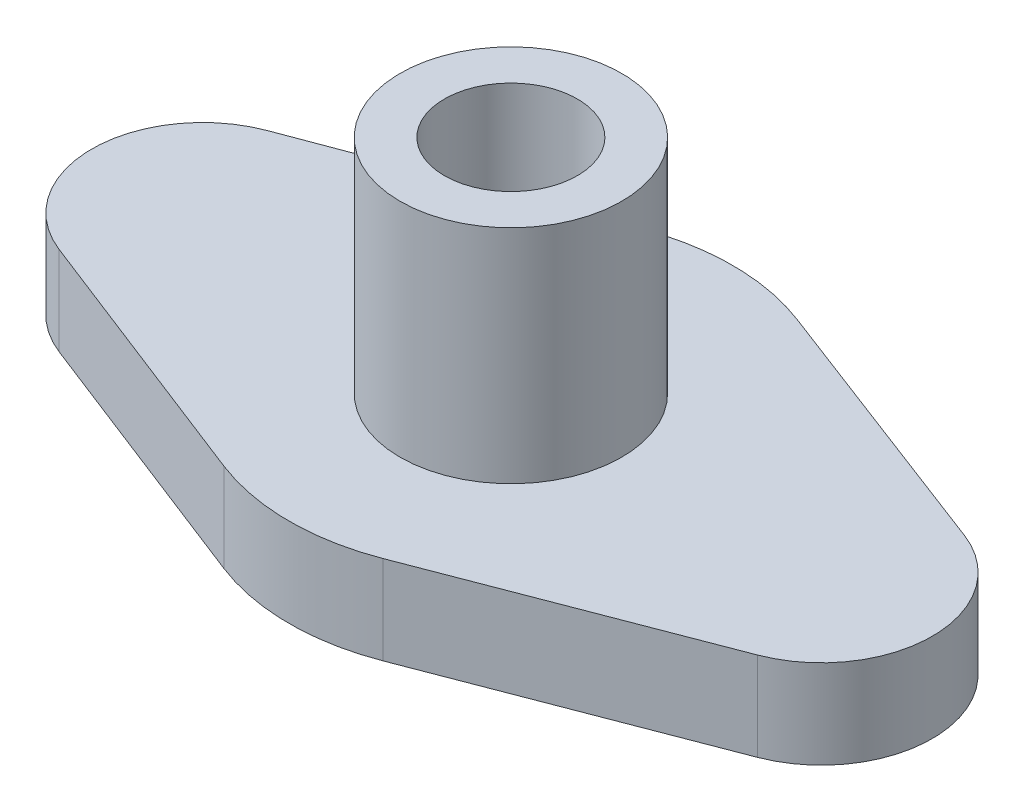
ISO-10303-21;
HEADER;
FILE_DESCRIPTION(('STEP AP214'),'2;1');
FILE_NAME('part.step','',(''),(''),'','','');
FILE_SCHEMA(('AUTOMOTIVE_DESIGN { 1 0 10303 214 1 1 1 1 }'));
ENDSEC;
DATA;
#1=APPLICATION_CONTEXT('core data for automotive mechanical design processes');
#2=APPLICATION_PROTOCOL_DEFINITION('international standard','automotive_design',2000,#1);
#3=PRODUCT_CONTEXT('',#1,'mechanical');
#4=PRODUCT('Part','Part','',(#3));
#5=PRODUCT_RELATED_PRODUCT_CATEGORY('part','',(#4));
#6=PRODUCT_DEFINITION_FORMATION('','',#4);
#7=PRODUCT_DEFINITION_CONTEXT('part definition',#1,'design');
#8=PRODUCT_DEFINITION('design','',#6,#7);
#9=PRODUCT_DEFINITION_SHAPE('','',#8);
#10=(LENGTH_UNIT() NAMED_UNIT(*) SI_UNIT(.MILLI.,.METRE.));
#11=(NAMED_UNIT(*) PLANE_ANGLE_UNIT() SI_UNIT($,.RADIAN.));
#12=(NAMED_UNIT(*) SI_UNIT($,.STERADIAN.) SOLID_ANGLE_UNIT());
#13=UNCERTAINTY_MEASURE_WITH_UNIT(LENGTH_MEASURE(1.E-05),#10,'distance_accuracy_value','');
#14=(GEOMETRIC_REPRESENTATION_CONTEXT(3) GLOBAL_UNCERTAINTY_ASSIGNED_CONTEXT((#13)) GLOBAL_UNIT_ASSIGNED_CONTEXT((#10,
#11,#12)) REPRESENTATION_CONTEXT('',''));
#15=CARTESIAN_POINT('',(0.,0.,0.));
#16=DIRECTION('',(0.,0.,1.));
#17=DIRECTION('',(1.,0.,0.));
#18=AXIS2_PLACEMENT_3D('',#15,#16,#17);
#19=CARTESIAN_POINT('',(93.2606056713443,-24.1724948856327,-9.4727225084867));
#20=DIRECTION('',(0.,1.,0.));
#21=DIRECTION('',(0.,0.,1.));
#22=AXIS2_PLACEMENT_3D('',#19,#20,#21);
#23=CYLINDRICAL_SURFACE('',#22,25.);
#24=CARTESIAN_POINT('',(93.2606056713443,-4.17249488563268,-9.4727225084867));
#25=DIRECTION('',(0.,-1.,0.));
#26=DIRECTION('',(0.,0.,-1.));
#27=AXIS2_PLACEMENT_3D('',#24,#25,#26);
#28=CIRCLE('',#27,25.);
#29=CARTESIAN_POINT('',(102.17811921066,-4.17249488563268,-32.8281919380684));
#30=VERTEX_POINT('',#29);
#31=CARTESIAN_POINT('',(102.200232987339,-4.17249488563268,13.8742915072525));
#32=VERTEX_POINT('',#31);
#33=EDGE_CURVE('E142',#30,#32,#28,.T.);
#34=ORIENTED_EDGE('',*,*,#33,.T.);
#35=DIRECTION('',(0.,1.,0.));
#36=VECTOR('',#35,1.);
#37=CARTESIAN_POINT('',(102.200232987339,-24.1724948856327,13.8742915072525));
#38=LINE('',#37,#36);
#39=CARTESIAN_POINT('',(102.200232987339,-24.1724948856327,13.8742915072525));
#40=VERTEX_POINT('',#39);
#41=EDGE_CURVE('E42',#40,#32,#38,.T.);
#42=ORIENTED_EDGE('',*,*,#41,.F.);
#43=CARTESIAN_POINT('',(93.2606056713443,-24.1724948856327,-9.4727225084867));
#44=DIRECTION('',(0.,-1.,0.));
#45=DIRECTION('',(0.,0.,-1.));
#46=AXIS2_PLACEMENT_3D('',#43,#44,#45);
#47=CIRCLE('',#46,25.);
#48=CARTESIAN_POINT('',(102.17811921066,-24.1724948856327,-32.8281919380684));
#49=VERTEX_POINT('',#48);
#50=EDGE_CURVE('E165',#49,#40,#47,.T.);
#51=ORIENTED_EDGE('',*,*,#50,.F.);
#52=DIRECTION('',(0.,1.,0.));
#53=VECTOR('',#52,1.);
#54=CARTESIAN_POINT('',(102.17811921066,-24.1724948856327,-32.8281919380684));
#55=LINE('',#54,#53);
#56=EDGE_CURVE('E138',#49,#30,#55,.T.);
#57=ORIENTED_EDGE('',*,*,#56,.T.);
#58=EDGE_LOOP('',(#34,#42,#51,#57));
#59=FACE_BOUND('',#58,.T.);
#60=ADVANCED_FACE('F39',(#59),#23,.T.);
#61=CARTESIAN_POINT('',(41.1398681505179,-24.1724948856327,37.2544507452542));
#62=DIRECTION('',(-0.357585092639783,0.,-0.933880560629569));
#63=DIRECTION('',(-0.933880560629569,0.,0.357585092639783));
#64=AXIS2_PLACEMENT_3D('',#61,#62,#63);
#65=PLANE('',#64);
#66=DIRECTION('',(-0.933880560629569,0.,0.357585092639783));
#67=VECTOR('',#66,1.);
#68=CARTESIAN_POINT('',(41.1398681505179,-4.17249488563268,37.2544507452542));
#69=LINE('',#68,#67);
#70=CARTESIAN_POINT('',(41.1398681505179,-4.17249488563268,37.2544507452542));
#71=VERTEX_POINT('',#70);
#72=EDGE_CURVE('E146',#32,#71,#69,.T.);
#73=ORIENTED_EDGE('',*,*,#72,.T.);
#74=DIRECTION('',(0.,1.,0.));
#75=VECTOR('',#74,1.);
#76=CARTESIAN_POINT('',(41.1398681505179,-24.1724948856327,37.2544507452542));
#77=LINE('',#76,#75);
#78=CARTESIAN_POINT('',(41.1398681505179,-24.1724948856327,37.2544507452542));
#79=VERTEX_POINT('',#78);
#80=EDGE_CURVE('E179',#79,#71,#77,.T.);
#81=ORIENTED_EDGE('',*,*,#80,.F.);
#82=DIRECTION('',(-0.933880560629569,0.,0.357585092639783));
#83=VECTOR('',#82,1.);
#84=CARTESIAN_POINT('',(41.1398681505179,-24.1724948856327,37.2544507452542));
#85=LINE('',#84,#83);
#86=EDGE_CURVE('E101',#40,#79,#85,.T.);
#87=ORIENTED_EDGE('',*,*,#86,.F.);
#88=ORIENTED_EDGE('',*,*,#41,.T.);
#89=EDGE_LOOP('',(#73,#81,#87,#88));
#90=FACE_BOUND('',#89,.T.);
#91=ADVANCED_FACE('F187',(#90),#65,.F.);
#92=CARTESIAN_POINT('',(23.2606135185288,-24.1724948856327,-9.43957728622426));
#93=DIRECTION('',(0.,1.,0.));
#94=DIRECTION('',(0.,0.,1.));
#95=AXIS2_PLACEMENT_3D('',#92,#93,#94);
#96=CYLINDRICAL_SURFACE('',#95,50.);
#97=CARTESIAN_POINT('',(23.2606135185288,-4.17249488563268,-9.43957728622426));
#98=DIRECTION('',(0.,-1.,0.));
#99=DIRECTION('',(0.,0.,-1.));
#100=AXIS2_PLACEMENT_3D('',#97,#98,#99);
#101=CIRCLE('',#100,50.);
#102=CARTESIAN_POINT('',(5.10373082097232,-4.17249488563268,37.1471977760955));
#103=VERTEX_POINT('',#102);
#104=EDGE_CURVE('E150',#71,#103,#101,.T.);
#105=ORIENTED_EDGE('',*,*,#104,.T.);
#106=DIRECTION('',(0.,1.,0.));
#107=VECTOR('',#106,1.);
#108=CARTESIAN_POINT('',(5.10373082097232,-24.1724948856327,37.1471977760955));
#109=LINE('',#108,#107);
#110=CARTESIAN_POINT('',(5.10373082097232,-24.1724948856327,37.1471977760955));
#111=VERTEX_POINT('',#110);
#112=EDGE_CURVE('E176',#111,#103,#109,.T.);
#113=ORIENTED_EDGE('',*,*,#112,.F.);
#114=CARTESIAN_POINT('',(23.2606135185288,-24.1724948856327,-9.43957728622426));
#115=DIRECTION('',(0.,-1.,0.));
#116=DIRECTION('',(0.,0.,-1.));
#117=AXIS2_PLACEMENT_3D('',#114,#115,#116);
#118=CIRCLE('',#117,50.);
#119=EDGE_CURVE('E203',#79,#111,#118,.T.);
#120=ORIENTED_EDGE('',*,*,#119,.F.);
#121=ORIENTED_EDGE('',*,*,#80,.T.);
#122=EDGE_LOOP('',(#105,#113,#120,#121));
#123=FACE_BOUND('',#122,.T.);
#124=ADVANCED_FACE('F196',(#123),#96,.T.);
#125=CARTESIAN_POINT('',(-55.8163825596614,-24.1724948856327,13.4039927335843));
#126=DIRECTION('',(0.363137653951129,0.,-0.931735501246395));
#127=DIRECTION('',(-0.931735501246395,0.,-0.363137653951129));
#128=AXIS2_PLACEMENT_3D('',#125,#126,#127);
#129=PLANE('',#128);
#130=DIRECTION('',(-0.931735501246395,0.,-0.363137653951129));
#131=VECTOR('',#130,1.);
#132=CARTESIAN_POINT('',(-55.8163825596614,-4.17249488563268,13.4039927335843));
#133=LINE('',#132,#131);
#134=CARTESIAN_POINT('',(-55.8163825596614,-4.17249488563268,13.4039927335843));
#135=VERTEX_POINT('',#134);
#136=EDGE_CURVE('E153',#103,#135,#133,.T.);
#137=ORIENTED_EDGE('',*,*,#136,.T.);
#138=DIRECTION('',(0.,1.,0.));
#139=VECTOR('',#138,1.);
#140=CARTESIAN_POINT('',(-55.8163825596614,-24.1724948856327,13.4039927335843));
#141=LINE('',#140,#139);
#142=CARTESIAN_POINT('',(-55.8163825596614,-24.1724948856327,13.4039927335843));
#143=VERTEX_POINT('',#142);
#144=EDGE_CURVE('E172',#143,#135,#141,.T.);
#145=ORIENTED_EDGE('',*,*,#144,.F.);
#146=DIRECTION('',(-0.931735501246395,0.,-0.363137653951129));
#147=VECTOR('',#146,1.);
#148=CARTESIAN_POINT('',(-55.8163825596614,-24.1724948856327,13.4039927335843));
#149=LINE('',#148,#147);
#150=EDGE_CURVE('E201',#111,#143,#149,.T.);
#151=ORIENTED_EDGE('',*,*,#150,.F.);
#152=ORIENTED_EDGE('',*,*,#112,.T.);
#153=EDGE_LOOP('',(#137,#145,#151,#152));
#154=FACE_BOUND('',#153,.T.);
#155=ADVANCED_FACE('F199',(#154),#129,.F.);
#156=CARTESIAN_POINT('',(-46.7379412108832,-24.1724948856327,-9.88939479757558));
#157=DIRECTION('',(0.,1.,0.));
#158=DIRECTION('',(0.,0.,1.));
#159=AXIS2_PLACEMENT_3D('',#156,#157,#158);
#160=CYLINDRICAL_SURFACE('',#159,25.);
#161=CARTESIAN_POINT('',(-46.7379412108832,-4.17249488563268,-9.88939479757558));
#162=DIRECTION('',(0.,-1.,0.));
#163=DIRECTION('',(0.,0.,-1.));
#164=AXIS2_PLACEMENT_3D('',#161,#162,#163);
#165=CIRCLE('',#164,25.);
#166=CARTESIAN_POINT('',(-55.5162740277713,-4.17249488563268,-33.2975316938761));
#167=VERTEX_POINT('',#166);
#168=EDGE_CURVE('E156',#135,#167,#165,.T.);
#169=ORIENTED_EDGE('',*,*,#168,.T.);
#170=DIRECTION('',(0.,1.,0.));
#171=VECTOR('',#170,1.);
#172=CARTESIAN_POINT('',(-55.5162740277713,-24.1724948856327,-33.2975316938761));
#173=LINE('',#172,#171);
#174=CARTESIAN_POINT('',(-55.5162740277713,-24.1724948856327,-33.2975316938761));
#175=VERTEX_POINT('',#174);
#176=EDGE_CURVE('E131',#175,#167,#173,.T.);
#177=ORIENTED_EDGE('',*,*,#176,.F.);
#178=CARTESIAN_POINT('',(-46.7379412108832,-24.1724948856327,-9.88939479757558));
#179=DIRECTION('',(0.,-1.,0.));
#180=DIRECTION('',(0.,0.,-1.));
#181=AXIS2_PLACEMENT_3D('',#178,#179,#180);
#182=CIRCLE('',#181,25.);
#183=EDGE_CURVE('E120',#143,#175,#182,.T.);
#184=ORIENTED_EDGE('',*,*,#183,.F.);
#185=ORIENTED_EDGE('',*,*,#144,.T.);
#186=EDGE_LOOP('',(#169,#177,#184,#185));
#187=FACE_BOUND('',#186,.T.);
#188=ADVANCED_FACE('F263',(#187),#160,.T.);
#189=CARTESIAN_POINT('',(5.70394788475254,-24.1724948856327,-56.2558510788253));
#190=DIRECTION('',(0.351133312675524,0.,0.93632547585202));
#191=DIRECTION('',(0.93632547585202,0.,-0.351133312675524));
#192=AXIS2_PLACEMENT_3D('',#189,#190,#191);
#193=PLANE('',#192);
#194=DIRECTION('',(0.93632547585202,0.,-0.351133312675524));
#195=VECTOR('',#194,1.);
#196=CARTESIAN_POINT('',(5.70394788475254,-4.17249488563268,-56.2558510788253));
#197=LINE('',#196,#195);
#198=CARTESIAN_POINT('',(5.70394788475252,-4.17249488563268,-56.2558510788253));
#199=VERTEX_POINT('',#198);
#200=EDGE_CURVE('E129',#167,#199,#197,.T.);
#201=ORIENTED_EDGE('',*,*,#200,.T.);
#202=DIRECTION('',(0.,1.,0.));
#203=VECTOR('',#202,1.);
#204=CARTESIAN_POINT('',(5.70394788475252,-24.1724948856327,-56.2558510788253));
#205=LINE('',#204,#203);
#206=CARTESIAN_POINT('',(5.70394788475252,-24.1724948856327,-56.2558510788253));
#207=VERTEX_POINT('',#206);
#208=EDGE_CURVE('E126',#207,#199,#205,.T.);
#209=ORIENTED_EDGE('',*,*,#208,.F.);
#210=DIRECTION('',(0.93632547585202,0.,-0.351133312675524));
#211=VECTOR('',#210,1.);
#212=CARTESIAN_POINT('',(5.70394788475254,-24.1724948856327,-56.2558510788253));
#213=LINE('',#212,#211);
#214=EDGE_CURVE('E114',#175,#207,#213,.T.);
#215=ORIENTED_EDGE('',*,*,#214,.F.);
#216=ORIENTED_EDGE('',*,*,#176,.T.);
#217=EDGE_LOOP('',(#201,#209,#215,#216));
#218=FACE_BOUND('',#217,.T.);
#219=ADVANCED_FACE('F127',(#218),#193,.F.);
#220=CARTESIAN_POINT('',(23.2606135185288,-24.1724948856327,-9.43957728622426));
#221=DIRECTION('',(0.,1.,0.));
#222=DIRECTION('',(0.,0.,1.));
#223=AXIS2_PLACEMENT_3D('',#220,#221,#222);
#224=CYLINDRICAL_SURFACE('',#223,50.);
#225=CARTESIAN_POINT('',(23.2606135185288,-4.17249488563268,-9.43957728622426));
#226=DIRECTION('',(0.,-1.,0.));
#227=DIRECTION('',(0.,0.,-1.));
#228=AXIS2_PLACEMENT_3D('',#225,#226,#227);
#229=CIRCLE('',#228,50.);
#230=CARTESIAN_POINT('',(41.0956405971598,-4.17249488563268,-56.1505161453876));
#231=VERTEX_POINT('',#230);
#232=EDGE_CURVE('E86',#199,#231,#229,.T.);
#233=ORIENTED_EDGE('',*,*,#232,.T.);
#234=DIRECTION('',(0.,1.,0.));
#235=VECTOR('',#234,1.);
#236=CARTESIAN_POINT('',(41.0956405971598,-24.1724948856327,-56.1505161453876));
#237=LINE('',#236,#235);
#238=CARTESIAN_POINT('',(41.0956405971598,-24.1724948856327,-56.1505161453876));
#239=VERTEX_POINT('',#238);
#240=EDGE_CURVE('E132',#239,#231,#237,.T.);
#241=ORIENTED_EDGE('',*,*,#240,.F.);
#242=CARTESIAN_POINT('',(23.2606135185288,-24.1724948856327,-9.43957728622426));
#243=DIRECTION('',(0.,-1.,0.));
#244=DIRECTION('',(0.,0.,-1.));
#245=AXIS2_PLACEMENT_3D('',#242,#243,#244);
#246=CIRCLE('',#245,50.);
#247=EDGE_CURVE('E118',#207,#239,#246,.T.);
#248=ORIENTED_EDGE('',*,*,#247,.F.);
#249=ORIENTED_EDGE('',*,*,#208,.T.);
#250=EDGE_LOOP('',(#233,#241,#248,#249));
#251=FACE_BOUND('',#250,.T.);
#252=ADVANCED_FACE('F134',(#251),#224,.T.);
#253=CARTESIAN_POINT('',(102.17811921066,-24.1724948856327,-32.8281919380684));
#254=DIRECTION('',(-0.35670054157262,0.,0.934218777183267));
#255=DIRECTION('',(0.934218777183267,0.,0.35670054157262));
#256=AXIS2_PLACEMENT_3D('',#253,#254,#255);
#257=PLANE('',#256);
#258=DIRECTION('',(0.934218777183267,0.,0.35670054157262));
#259=VECTOR('',#258,1.);
#260=CARTESIAN_POINT('',(102.17811921066,-4.17249488563268,-32.8281919380684));
#261=LINE('',#260,#259);
#262=EDGE_CURVE('E92',#231,#30,#261,.T.);
#263=ORIENTED_EDGE('',*,*,#262,.T.);
#264=ORIENTED_EDGE('',*,*,#56,.F.);
#265=DIRECTION('',(0.934218777183267,0.,0.35670054157262));
#266=VECTOR('',#265,1.);
#267=CARTESIAN_POINT('',(102.17811921066,-24.1724948856327,-32.8281919380684));
#268=LINE('',#267,#266);
#269=EDGE_CURVE('E57',#239,#49,#268,.T.);
#270=ORIENTED_EDGE('',*,*,#269,.F.);
#271=ORIENTED_EDGE('',*,*,#240,.T.);
#272=EDGE_LOOP('',(#263,#264,#270,#271));
#273=FACE_BOUND('',#272,.T.);
#274=ADVANCED_FACE('F249',(#273),#257,.F.);
#275=CARTESIAN_POINT('',(93.2606056713443,-24.1724948856327,-9.4727225084867));
#276=DIRECTION('',(0.,-1.,0.));
#277=DIRECTION('',(0.,0.,-1.));
#278=AXIS2_PLACEMENT_3D('',#275,#276,#277);
#279=PLANE('',#278);
#280=CARTESIAN_POINT('',(23.2606135185287,-24.1724948856327,-9.43957728622424));
#281=DIRECTION('',(0.,1.,0.));
#282=DIRECTION('',(0.,0.,1.));
#283=AXIS2_PLACEMENT_3D('',#280,#281,#282);
#284=CIRCLE('',#283,15.);
#285=CARTESIAN_POINT('',(23.2606135185287,-24.1724948856327,5.56042271377576));
#286=VERTEX_POINT('',#285);
#287=EDGE_CURVE('E216',#286,#286,#284,.T.);
#288=ORIENTED_EDGE('',*,*,#287,.T.);
#289=EDGE_LOOP('',(#288));
#290=FACE_BOUND('',#289,.T.);
#291=ORIENTED_EDGE('',*,*,#50,.T.);
#292=ORIENTED_EDGE('',*,*,#86,.T.);
#293=ORIENTED_EDGE('',*,*,#119,.T.);
#294=ORIENTED_EDGE('',*,*,#150,.T.);
#295=ORIENTED_EDGE('',*,*,#183,.T.);
#296=ORIENTED_EDGE('',*,*,#214,.T.);
#297=ORIENTED_EDGE('',*,*,#247,.T.);
#298=ORIENTED_EDGE('',*,*,#269,.T.);
#299=EDGE_LOOP('',(#291,#292,#293,#294,#295,#296,#297,#298));
#300=FACE_BOUND('',#299,.T.);
#301=ADVANCED_FACE('F116',(#290,#300),#279,.T.);
#302=CARTESIAN_POINT('',(93.2606056713443,-4.17249488563268,-9.4727225084867));
#303=DIRECTION('',(0.,-1.,0.));
#304=DIRECTION('',(0.,0.,-1.));
#305=AXIS2_PLACEMENT_3D('',#302,#303,#304);
#306=PLANE('',#305);
#307=CARTESIAN_POINT('',(23.2606135185287,-4.17249488563268,-9.43957728622424));
#308=DIRECTION('',(0.,1.,0.));
#309=DIRECTION('',(0.,0.,1.));
#310=AXIS2_PLACEMENT_3D('',#307,#308,#309);
#311=CIRCLE('',#310,25.);
#312=CARTESIAN_POINT('',(23.2606135185287,-4.17249488563268,15.5604227137758));
#313=VERTEX_POINT('',#312);
#314=EDGE_CURVE('E11',#313,#313,#311,.T.);
#315=ORIENTED_EDGE('',*,*,#314,.F.);
#316=EDGE_LOOP('',(#315));
#317=FACE_BOUND('',#316,.T.);
#318=ORIENTED_EDGE('',*,*,#33,.F.);
#319=ORIENTED_EDGE('',*,*,#262,.F.);
#320=ORIENTED_EDGE('',*,*,#232,.F.);
#321=ORIENTED_EDGE('',*,*,#200,.F.);
#322=ORIENTED_EDGE('',*,*,#168,.F.);
#323=ORIENTED_EDGE('',*,*,#136,.F.);
#324=ORIENTED_EDGE('',*,*,#104,.F.);
#325=ORIENTED_EDGE('',*,*,#72,.F.);
#326=EDGE_LOOP('',(#318,#319,#320,#321,#322,#323,#324,#325));
#327=FACE_BOUND('',#326,.T.);
#328=ADVANCED_FACE('F192',(#317,#327),#306,.F.);
#329=CARTESIAN_POINT('',(23.2606135185287,45.8275051143673,-9.43957728622424));
#330=DIRECTION('',(0.,-1.,0.));
#331=DIRECTION('',(0.,0.,-1.));
#332=AXIS2_PLACEMENT_3D('',#329,#330,#331);
#333=CYLINDRICAL_SURFACE('',#332,25.);
#334=CARTESIAN_POINT('',(23.2606135185287,45.8275051143673,-9.43957728622424));
#335=DIRECTION('',(0.,1.,0.));
#336=DIRECTION('',(0.,0.,1.));
#337=AXIS2_PLACEMENT_3D('',#334,#335,#336);
#338=CIRCLE('',#337,25.);
#339=CARTESIAN_POINT('',(23.2606135185287,45.8275051143673,15.5604227137758));
#340=VERTEX_POINT('',#339);
#341=EDGE_CURVE('E147',#340,#340,#338,.T.);
#342=ORIENTED_EDGE('',*,*,#341,.F.);
#343=EDGE_LOOP('',(#342));
#344=FACE_BOUND('',#343,.T.);
#345=ORIENTED_EDGE('',*,*,#314,.T.);
#346=EDGE_LOOP('',(#345));
#347=FACE_BOUND('',#346,.T.);
#348=ADVANCED_FACE('F235',(#344,#347),#333,.T.);
#349=CARTESIAN_POINT('',(23.2606135185287,45.8275051143673,-9.43957728622424));
#350=DIRECTION('',(0.,1.,0.));
#351=DIRECTION('',(0.,0.,1.));
#352=AXIS2_PLACEMENT_3D('',#349,#350,#351);
#353=PLANE('',#352);
#354=CARTESIAN_POINT('',(23.2606135185287,45.8275051143673,-9.43957728622424));
#355=DIRECTION('',(0.,1.,0.));
#356=DIRECTION('',(0.,0.,1.));
#357=AXIS2_PLACEMENT_3D('',#354,#355,#356);
#358=CIRCLE('',#357,15.);
#359=CARTESIAN_POINT('',(23.2606135185287,45.8275051143673,5.56042271377576));
#360=VERTEX_POINT('',#359);
#361=EDGE_CURVE('E217',#360,#360,#358,.T.);
#362=ORIENTED_EDGE('',*,*,#361,.F.);
#363=EDGE_LOOP('',(#362));
#364=FACE_BOUND('',#363,.T.);
#365=ORIENTED_EDGE('',*,*,#341,.T.);
#366=EDGE_LOOP('',(#365));
#367=FACE_BOUND('',#366,.T.);
#368=ADVANCED_FACE('F229',(#364,#367),#353,.T.);
#369=CARTESIAN_POINT('',(23.2606135185287,-24.1724948856327,-9.43957728622424));
#370=DIRECTION('',(0.,1.,0.));
#371=DIRECTION('',(0.,0.,1.));
#372=AXIS2_PLACEMENT_3D('',#369,#370,#371);
#373=CYLINDRICAL_SURFACE('',#372,15.);
#374=ORIENTED_EDGE('',*,*,#287,.F.);
#375=EDGE_LOOP('',(#374));
#376=FACE_BOUND('',#375,.T.);
#377=ORIENTED_EDGE('',*,*,#361,.T.);
#378=EDGE_LOOP('',(#377));
#379=FACE_BOUND('',#378,.T.);
#380=ADVANCED_FACE('F226',(#376,#379),#373,.F.);
#381=CLOSED_SHELL('',(#60,#91,#124,#155,#188,#219,#252,#274,#301,#328,#348,#368,#380));
#382=MANIFOLD_SOLID_BREP('B2',#381);
#383=ADVANCED_BREP_SHAPE_REPRESENTATION('',(#18,#382),#14);
#384=SHAPE_DEFINITION_REPRESENTATION(#9,#383);
ENDSEC;
END-ISO-10303-21;
